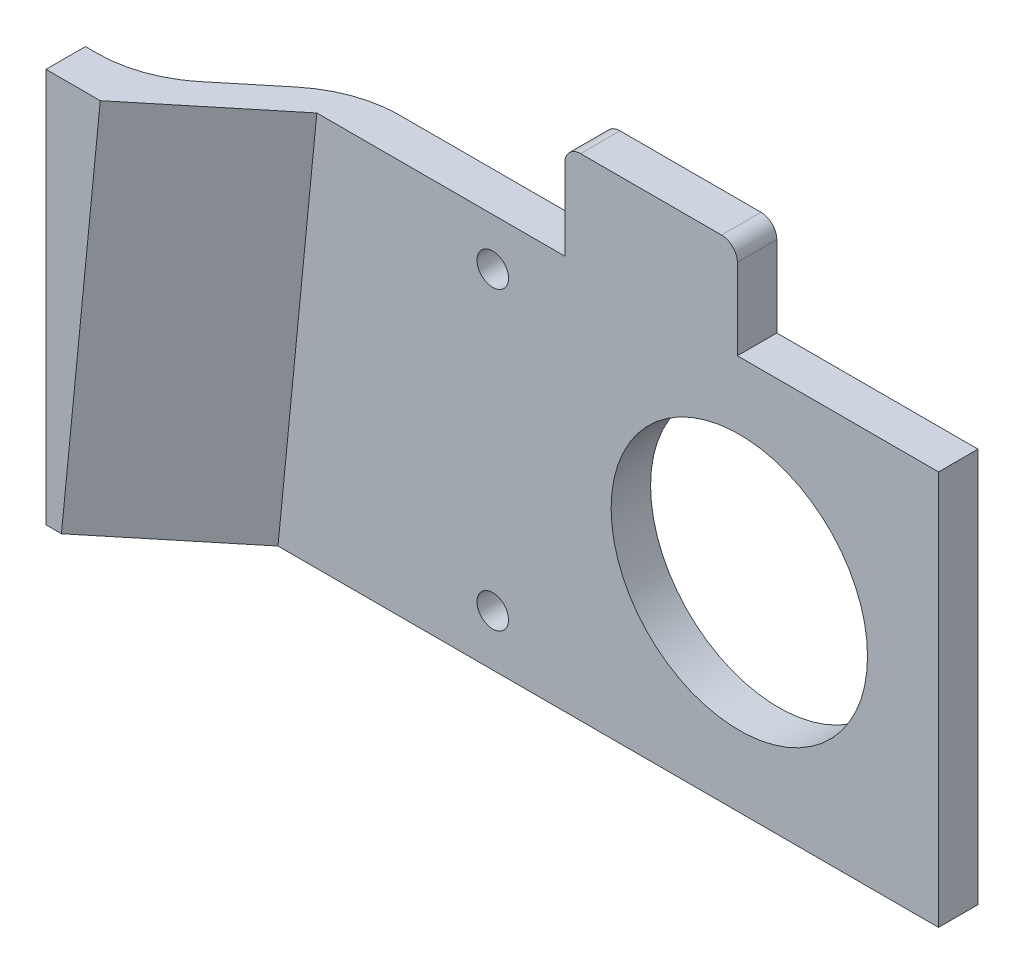
ISO-10303-21;
HEADER;
FILE_DESCRIPTION(('STEP AP214'),'2;1');
FILE_NAME('part.step','',(''),(''),'','','');
FILE_SCHEMA(('AUTOMOTIVE_DESIGN { 1 0 10303 214 1 1 1 1 }'));
ENDSEC;
DATA;
#1=APPLICATION_CONTEXT('core data for automotive mechanical design processes');
#2=APPLICATION_PROTOCOL_DEFINITION('international standard','automotive_design',2000,#1);
#3=PRODUCT_CONTEXT('',#1,'mechanical');
#4=PRODUCT('Part','Part','',(#3));
#5=PRODUCT_RELATED_PRODUCT_CATEGORY('part','',(#4));
#6=PRODUCT_DEFINITION_FORMATION('','',#4);
#7=PRODUCT_DEFINITION_CONTEXT('part definition',#1,'design');
#8=PRODUCT_DEFINITION('design','',#6,#7);
#9=PRODUCT_DEFINITION_SHAPE('','',#8);
#10=(LENGTH_UNIT() NAMED_UNIT(*) SI_UNIT(.MILLI.,.METRE.));
#11=(NAMED_UNIT(*) PLANE_ANGLE_UNIT() SI_UNIT($,.RADIAN.));
#12=(NAMED_UNIT(*) SI_UNIT($,.STERADIAN.) SOLID_ANGLE_UNIT());
#13=UNCERTAINTY_MEASURE_WITH_UNIT(LENGTH_MEASURE(1.E-05),#10,'distance_accuracy_value','');
#14=(GEOMETRIC_REPRESENTATION_CONTEXT(3) GLOBAL_UNCERTAINTY_ASSIGNED_CONTEXT((#13)) GLOBAL_UNIT_ASSIGNED_CONTEXT((#10,
#11,#12)) REPRESENTATION_CONTEXT('',''));
#15=CARTESIAN_POINT('',(0.,0.,0.));
#16=DIRECTION('',(0.,0.,1.));
#17=DIRECTION('',(1.,0.,0.));
#18=AXIS2_PLACEMENT_3D('',#15,#16,#17);
#19=CARTESIAN_POINT('',(47.2143168379992,-4.64753017723971,57.5060662904832));
#20=DIRECTION('',(-0.633322094914091,0.0623409115104892,-0.771373278540078));
#21=DIRECTION('',(-0.772876590210645,0.,0.634556361802769));
#22=AXIS2_PLACEMENT_3D('',#19,#20,#21);
#23=PLANE('',#22);
#24=DIRECTION('',(0.0979613156523279,0.995190223342083,0.));
#25=VECTOR('',#24,1.);
#26=CARTESIAN_POINT('',(59.4394379474624,18.6288012395591,49.3500000000001));
#27=LINE('',#26,#25);
#28=CARTESIAN_POINT('',(56.6115251519666,-10.1,49.35));
#29=VERTEX_POINT('',#28);
#30=CARTESIAN_POINT('',(58.5802204497027,9.9,49.35));
#31=VERTEX_POINT('',#30);
#32=EDGE_CURVE('E213',#29,#31,#27,.T.);
#33=ORIENTED_EDGE('',*,*,#32,.T.);
#34=DIRECTION('',(-0.772876590210645,0.,0.634556361802769));
#35=VECTOR('',#34,1.);
#36=CARTESIAN_POINT('',(47.7909215407242,9.9,58.208358952518));
#37=LINE('',#36,#35);
#38=CARTESIAN_POINT('',(52.5512223152048,9.9,54.3));
#39=VERTEX_POINT('',#38);
#40=EDGE_CURVE('E315',#31,#39,#37,.T.);
#41=ORIENTED_EDGE('',*,*,#40,.T.);
#42=DIRECTION('',(-0.0979613156523277,-0.995190223342083,0.));
#43=VECTOR('',#42,1.);
#44=CARTESIAN_POINT('',(50.2306631430652,-13.6745894736284,54.3));
#45=LINE('',#44,#43);
#46=CARTESIAN_POINT('',(50.5825270174687,-10.1,54.3));
#47=VERTEX_POINT('',#46);
#48=EDGE_CURVE('E208',#39,#47,#45,.T.);
#49=ORIENTED_EDGE('',*,*,#48,.T.);
#50=DIRECTION('',(-0.772876590210645,0.,0.634556361802769));
#51=VECTOR('',#50,1.);
#52=CARTESIAN_POINT('',(46.9982031951358,-10.1,57.2428443208543));
#53=LINE('',#52,#51);
#54=EDGE_CURVE('E227',#29,#47,#53,.T.);
#55=ORIENTED_EDGE('',*,*,#54,.F.);
#56=EDGE_LOOP('',(#33,#41,#49,#55));
#57=FACE_BOUND('',#56,.T.);
#58=ADVANCED_FACE('F37',(#57),#23,.F.);
#59=CARTESIAN_POINT('',(50.4500000000004,-10.15,54.3));
#60=DIRECTION('',(0.,0.,-1.));
#61=DIRECTION('',(-1.,0.,0.));
#62=AXIS2_PLACEMENT_3D('',#59,#60,#61);
#63=PLANE('',#62);
#64=ORIENTED_EDGE('',*,*,#48,.F.);
#65=DIRECTION('',(-1.,0.,0.));
#66=VECTOR('',#65,1.);
#67=CARTESIAN_POINT('',(50.4500000000004,9.89999999999999,54.3));
#68=LINE('',#67,#66);
#69=CARTESIAN_POINT('',(49.8000000000002,9.9,54.3));
#70=VERTEX_POINT('',#69);
#71=EDGE_CURVE('E311',#39,#70,#68,.T.);
#72=ORIENTED_EDGE('',*,*,#71,.T.);
#73=DIRECTION('',(0.,1.,0.));
#74=VECTOR('',#73,1.);
#75=CARTESIAN_POINT('',(49.8000000000002,-10.15,54.3));
#76=LINE('',#75,#74);
#77=CARTESIAN_POINT('',(49.8000000000002,-10.1,54.3));
#78=VERTEX_POINT('',#77);
#79=EDGE_CURVE('E275',#78,#70,#76,.T.);
#80=ORIENTED_EDGE('',*,*,#79,.F.);
#81=DIRECTION('',(-1.,0.,0.));
#82=VECTOR('',#81,1.);
#83=CARTESIAN_POINT('',(50.4500000000004,-10.1,54.3));
#84=LINE('',#83,#82);
#85=EDGE_CURVE('E257',#47,#78,#84,.T.);
#86=ORIENTED_EDGE('',*,*,#85,.F.);
#87=EDGE_LOOP('',(#64,#72,#80,#86));
#88=FACE_BOUND('',#87,.T.);
#89=ADVANCED_FACE('F296',(#88),#63,.F.);
#90=CARTESIAN_POINT('',(89.45,-10.15,49.35));
#91=DIRECTION('',(0.,0.,-1.));
#92=DIRECTION('',(-1.,0.,0.));
#93=AXIS2_PLACEMENT_3D('',#90,#91,#92);
#94=PLANE('',#93);
#95=CARTESIAN_POINT('',(67.5000000000002,7.5,49.35));
#96=DIRECTION('',(0.,0.,1.));
#97=DIRECTION('',(1.,0.,0.));
#98=AXIS2_PLACEMENT_3D('',#95,#96,#97);
#99=CIRCLE('',#98,0.799999999999995);
#100=CARTESIAN_POINT('',(68.3000000000002,7.5,49.35));
#101=VERTEX_POINT('',#100);
#102=EDGE_CURVE('E243',#101,#101,#99,.T.);
#103=ORIENTED_EDGE('',*,*,#102,.F.);
#104=EDGE_LOOP('',(#103));
#105=FACE_BOUND('',#104,.T.);
#106=CARTESIAN_POINT('',(67.5000000000002,-7.49999999999999,49.35));
#107=DIRECTION('',(0.,0.,1.));
#108=DIRECTION('',(1.,0.,0.));
#109=AXIS2_PLACEMENT_3D('',#106,#107,#108);
#110=CIRCLE('',#109,0.799999999999995);
#111=CARTESIAN_POINT('',(68.3000000000002,-7.49999999999999,49.35));
#112=VERTEX_POINT('',#111);
#113=EDGE_CURVE('E252',#112,#112,#110,.T.);
#114=ORIENTED_EDGE('',*,*,#113,.F.);
#115=EDGE_LOOP('',(#114));
#116=FACE_BOUND('',#115,.T.);
#117=CARTESIAN_POINT('',(80.0000000000002,0.,49.35));
#118=DIRECTION('',(0.,0.,1.));
#119=DIRECTION('',(1.,0.,0.));
#120=AXIS2_PLACEMENT_3D('',#117,#118,#119);
#121=CIRCLE('',#120,6.5);
#122=CARTESIAN_POINT('',(86.5000000000002,0.,49.35));
#123=VERTEX_POINT('',#122);
#124=EDGE_CURVE('E238',#123,#123,#121,.T.);
#125=ORIENTED_EDGE('',*,*,#124,.F.);
#126=EDGE_LOOP('',(#125));
#127=FACE_BOUND('',#126,.T.);
#128=DIRECTION('',(0.,1.,0.));
#129=VECTOR('',#128,1.);
#130=CARTESIAN_POINT('',(71.1500000000002,-10.15,49.35));
#131=LINE('',#130,#129);
#132=CARTESIAN_POINT('',(71.1500000000002,9.9,49.35));
#133=VERTEX_POINT('',#132);
#134=CARTESIAN_POINT('',(71.1500000000002,14.,49.35));
#135=VERTEX_POINT('',#134);
#136=EDGE_CURVE('E323',#133,#135,#131,.T.);
#137=ORIENTED_EDGE('',*,*,#136,.F.);
#138=DIRECTION('',(-1.,0.,0.));
#139=VECTOR('',#138,1.);
#140=CARTESIAN_POINT('',(89.45,9.90000000000001,49.35));
#141=LINE('',#140,#139);
#142=EDGE_CURVE('E199',#133,#31,#141,.T.);
#143=ORIENTED_EDGE('',*,*,#142,.T.);
#144=ORIENTED_EDGE('',*,*,#32,.F.);
#145=DIRECTION('',(-1.,0.,0.));
#146=VECTOR('',#145,1.);
#147=CARTESIAN_POINT('',(89.45,-10.1,49.35));
#148=LINE('',#147,#146);
#149=CARTESIAN_POINT('',(90.1000000000002,-10.1,49.35));
#150=VERTEX_POINT('',#149);
#151=EDGE_CURVE('E261',#150,#29,#148,.T.);
#152=ORIENTED_EDGE('',*,*,#151,.F.);
#153=DIRECTION('',(0.,-1.,0.));
#154=VECTOR('',#153,1.);
#155=CARTESIAN_POINT('',(90.1000000000002,-10.15,49.35));
#156=LINE('',#155,#154);
#157=CARTESIAN_POINT('',(90.1000000000002,9.9,49.35));
#158=VERTEX_POINT('',#157);
#159=EDGE_CURVE('E273',#158,#150,#156,.T.);
#160=ORIENTED_EDGE('',*,*,#159,.F.);
#161=DIRECTION('',(-1.,0.,0.));
#162=VECTOR('',#161,1.);
#163=CARTESIAN_POINT('',(89.45,9.9,49.35));
#164=LINE('',#163,#162);
#165=CARTESIAN_POINT('',(79.9000000000002,9.9,49.35));
#166=VERTEX_POINT('',#165);
#167=EDGE_CURVE('E389',#158,#166,#164,.T.);
#168=ORIENTED_EDGE('',*,*,#167,.T.);
#169=DIRECTION('',(0.,-1.,0.));
#170=VECTOR('',#169,1.);
#171=CARTESIAN_POINT('',(79.9000000000002,-10.15,49.35));
#172=LINE('',#171,#170);
#173=CARTESIAN_POINT('',(79.9000000000002,14.,49.35));
#174=VERTEX_POINT('',#173);
#175=EDGE_CURVE('E407',#174,#166,#172,.T.);
#176=ORIENTED_EDGE('',*,*,#175,.F.);
#177=CARTESIAN_POINT('',(79.1000000000002,14.,49.35));
#178=DIRECTION('',(0.,0.,-1.));
#179=DIRECTION('',(-1.,0.,0.));
#180=AXIS2_PLACEMENT_3D('',#177,#178,#179);
#181=CIRCLE('',#180,0.799999999999998);
#182=CARTESIAN_POINT('',(79.1000000000002,14.8,49.35));
#183=VERTEX_POINT('',#182);
#184=EDGE_CURVE('E172',#183,#174,#181,.T.);
#185=ORIENTED_EDGE('',*,*,#184,.F.);
#186=DIRECTION('',(1.,0.,0.));
#187=VECTOR('',#186,1.);
#188=CARTESIAN_POINT('',(89.45,14.8,49.35));
#189=LINE('',#188,#187);
#190=CARTESIAN_POINT('',(71.9500000000002,14.8,49.35));
#191=VERTEX_POINT('',#190);
#192=EDGE_CURVE('E336',#191,#183,#189,.T.);
#193=ORIENTED_EDGE('',*,*,#192,.F.);
#194=CARTESIAN_POINT('',(71.9500000000002,14.,49.35));
#195=DIRECTION('',(0.,0.,-1.));
#196=DIRECTION('',(-1.,0.,0.));
#197=AXIS2_PLACEMENT_3D('',#194,#195,#196);
#198=CIRCLE('',#197,0.799999999999998);
#199=EDGE_CURVE('E334',#135,#191,#198,.T.);
#200=ORIENTED_EDGE('',*,*,#199,.F.);
#201=EDGE_LOOP('',(#137,#143,#144,#152,#160,#168,#176,#185,#193,#200));
#202=FACE_BOUND('',#201,.T.);
#203=ADVANCED_FACE('F39',(#105,#116,#127,#202),#94,.F.);
#204=CARTESIAN_POINT('',(49.8000000000002,10.1,39.35));
#205=DIRECTION('',(-1.,0.,0.));
#206=DIRECTION('',(0.,0.,1.));
#207=AXIS2_PLACEMENT_3D('',#204,#205,#206);
#208=PLANE('',#207);
#209=DIRECTION('',(0.,0.,1.));
#210=VECTOR('',#209,1.);
#211=CARTESIAN_POINT('',(49.8000000000002,9.9,44.35));
#212=LINE('',#211,#210);
#213=CARTESIAN_POINT('',(49.8000000000002,9.9,52.3));
#214=VERTEX_POINT('',#213);
#215=EDGE_CURVE('E200',#214,#70,#212,.T.);
#216=ORIENTED_EDGE('',*,*,#215,.F.);
#217=DIRECTION('',(0.,-1.,0.));
#218=VECTOR('',#217,1.);
#219=CARTESIAN_POINT('',(49.8000000000002,-10.15,52.3));
#220=LINE('',#219,#218);
#221=CARTESIAN_POINT('',(49.8000000000002,-10.1,52.3));
#222=VERTEX_POINT('',#221);
#223=EDGE_CURVE('E164',#214,#222,#220,.T.);
#224=ORIENTED_EDGE('',*,*,#223,.T.);
#225=DIRECTION('',(0.,0.,1.));
#226=VECTOR('',#225,1.);
#227=CARTESIAN_POINT('',(49.8000000000002,-10.1,39.35));
#228=LINE('',#227,#226);
#229=EDGE_CURVE('E237',#222,#78,#228,.T.);
#230=ORIENTED_EDGE('',*,*,#229,.T.);
#231=ORIENTED_EDGE('',*,*,#79,.T.);
#232=EDGE_LOOP('',(#216,#224,#230,#231));
#233=FACE_BOUND('',#232,.T.);
#234=ADVANCED_FACE('F303',(#233),#208,.T.);
#235=CARTESIAN_POINT('',(90.1000000000002,10.1,39.35));
#236=DIRECTION('',(1.,0.,0.));
#237=DIRECTION('',(0.,0.,-1.));
#238=AXIS2_PLACEMENT_3D('',#235,#236,#237);
#239=PLANE('',#238);
#240=DIRECTION('',(0.,0.,1.));
#241=VECTOR('',#240,1.);
#242=CARTESIAN_POINT('',(90.1000000000002,9.9,44.35));
#243=LINE('',#242,#241);
#244=CARTESIAN_POINT('',(90.1000000000002,9.9,47.35));
#245=VERTEX_POINT('',#244);
#246=EDGE_CURVE('E400',#245,#158,#243,.T.);
#247=ORIENTED_EDGE('',*,*,#246,.T.);
#248=ORIENTED_EDGE('',*,*,#159,.T.);
#249=DIRECTION('',(0.,0.,1.));
#250=VECTOR('',#249,1.);
#251=CARTESIAN_POINT('',(90.1000000000002,-10.1,39.35));
#252=LINE('',#251,#250);
#253=CARTESIAN_POINT('',(90.1000000000002,-10.1,47.35));
#254=VERTEX_POINT('',#253);
#255=EDGE_CURVE('E254',#254,#150,#252,.T.);
#256=ORIENTED_EDGE('',*,*,#255,.F.);
#257=DIRECTION('',(0.,1.,0.));
#258=VECTOR('',#257,1.);
#259=CARTESIAN_POINT('',(90.1000000000002,-10.15,47.35));
#260=LINE('',#259,#258);
#261=EDGE_CURVE('E230',#254,#245,#260,.T.);
#262=ORIENTED_EDGE('',*,*,#261,.T.);
#263=EDGE_LOOP('',(#247,#248,#256,#262));
#264=FACE_BOUND('',#263,.T.);
#265=ADVANCED_FACE('F366',(#264),#239,.T.);
#266=CARTESIAN_POINT('',(49.8000000000002,-10.1,39.35));
#267=DIRECTION('',(0.,-1.,0.));
#268=DIRECTION('',(1.,0.,0.));
#269=AXIS2_PLACEMENT_3D('',#266,#267,#268);
#270=PLANE('',#269);
#271=DIRECTION('',(1.,0.,0.));
#272=VECTOR('',#271,1.);
#273=CARTESIAN_POINT('',(49.7500000000004,-10.1,52.3));
#274=LINE('',#273,#272);
#275=CARTESIAN_POINT('',(50.4097411583436,-10.1,52.3));
#276=VERTEX_POINT('',#275);
#277=EDGE_CURVE('E271',#222,#276,#274,.T.);
#278=ORIENTED_EDGE('',*,*,#277,.T.);
#279=DIRECTION('',(0.999994542016877,0.,-0.00330392742912632));
#280=VECTOR('',#279,1.);
#281=CARTESIAN_POINT('',(50.4097411583436,-10.1,52.3));
#282=LINE('',#281,#280);
#283=CARTESIAN_POINT('',(50.4500000000004,-10.1,52.2998669869828));
#284=VERTEX_POINT('',#283);
#285=EDGE_CURVE('E269',#276,#284,#282,.T.);
#286=ORIENTED_EDGE('',*,*,#285,.T.);
#287=CARTESIAN_POINT('',(50.4098552102629,-10.1,46.3));
#288=DIRECTION('',(0.,1.,0.));
#289=DIRECTION('',(-1.,0.,0.));
#290=AXIS2_PLACEMENT_3D('',#287,#288,#289);
#291=ELLIPSE('',#290,6.02899813449793,6.);
#292=CARTESIAN_POINT('',(54.2466068575516,-10.1,50.9282396712405));
#293=VERTEX_POINT('',#292);
#294=EDGE_CURVE('E267',#284,#293,#291,.T.);
#295=ORIENTED_EDGE('',*,*,#294,.T.);
#296=DIRECTION('',(0.772876590210646,0.,-0.634556361802768));
#297=VECTOR('',#296,1.);
#298=CARTESIAN_POINT('',(54.2466068575516,-10.1,50.9282396712405));
#299=LINE('',#298,#297);
#300=CARTESIAN_POINT('',(56.9340532897993,-10.1,48.7217603287595));
#301=VERTEX_POINT('',#300);
#302=EDGE_CURVE('E265',#293,#301,#299,.T.);
#303=ORIENTED_EDGE('',*,*,#302,.T.);
#304=CARTESIAN_POINT('',(60.770804937088,-10.1,53.35));
#305=DIRECTION('',(0.,-1.,0.));
#306=DIRECTION('',(-1.,0.,0.));
#307=AXIS2_PLACEMENT_3D('',#304,#305,#306);
#308=ELLIPSE('',#307,6.02899813449793,6.);
#309=CARTESIAN_POINT('',(60.770804937088,-10.1,47.35));
#310=VERTEX_POINT('',#309);
#311=EDGE_CURVE('E60',#301,#310,#308,.T.);
#312=ORIENTED_EDGE('',*,*,#311,.T.);
#313=DIRECTION('',(1.,0.,0.));
#314=VECTOR('',#313,1.);
#315=CARTESIAN_POINT('',(89.45,-10.1,47.35));
#316=LINE('',#315,#314);
#317=EDGE_CURVE('E205',#310,#254,#316,.T.);
#318=ORIENTED_EDGE('',*,*,#317,.T.);
#319=ORIENTED_EDGE('',*,*,#255,.T.);
#320=ORIENTED_EDGE('',*,*,#151,.T.);
#321=ORIENTED_EDGE('',*,*,#54,.T.);
#322=ORIENTED_EDGE('',*,*,#85,.T.);
#323=ORIENTED_EDGE('',*,*,#229,.F.);
#324=EDGE_LOOP('',(#278,#286,#295,#303,#312,#318,#319,#320,#321,#322,#323));
#325=FACE_BOUND('',#324,.T.);
#326=ADVANCED_FACE('F294',(#325),#270,.T.);
#327=CARTESIAN_POINT('',(49.7500000000004,-10.15,52.3));
#328=DIRECTION('',(0.,0.,1.));
#329=DIRECTION('',(1.,0.,0.));
#330=AXIS2_PLACEMENT_3D('',#327,#328,#329);
#331=PLANE('',#330);
#332=ORIENTED_EDGE('',*,*,#223,.F.);
#333=DIRECTION('',(1.,0.,0.));
#334=VECTOR('',#333,1.);
#335=CARTESIAN_POINT('',(49.7500000000004,9.89999999999999,52.3));
#336=LINE('',#335,#334);
#337=CARTESIAN_POINT('',(50.4097411583436,9.89999999999999,52.3));
#338=VERTEX_POINT('',#337);
#339=EDGE_CURVE('E324',#214,#338,#336,.T.);
#340=ORIENTED_EDGE('',*,*,#339,.T.);
#341=DIRECTION('',(0.,1.,0.));
#342=VECTOR('',#341,1.);
#343=CARTESIAN_POINT('',(50.4097411583436,-10.15,52.3));
#344=LINE('',#343,#342);
#345=EDGE_CURVE('E224',#276,#338,#344,.T.);
#346=ORIENTED_EDGE('',*,*,#345,.F.);
#347=ORIENTED_EDGE('',*,*,#277,.F.);
#348=EDGE_LOOP('',(#332,#340,#346,#347));
#349=FACE_BOUND('',#348,.T.);
#350=ADVANCED_FACE('F291',(#349),#331,.F.);
#351=CARTESIAN_POINT('',(50.4097411583436,-10.15,52.3));
#352=DIRECTION('',(0.00330392742912632,0.,0.999994542016877));
#353=DIRECTION('',(0.999994542016877,0.,-0.00330392742912632));
#354=AXIS2_PLACEMENT_3D('',#351,#352,#353);
#355=PLANE('',#354);
#356=ORIENTED_EDGE('',*,*,#345,.T.);
#357=DIRECTION('',(0.999994542016877,0.,-0.00330392742912632));
#358=VECTOR('',#357,1.);
#359=CARTESIAN_POINT('',(50.4097411583435,9.89999999999999,52.3));
#360=LINE('',#359,#358);
#361=CARTESIAN_POINT('',(50.4500000000004,9.89999999999998,52.2998669869828));
#362=VERTEX_POINT('',#361);
#363=EDGE_CURVE('E328',#338,#362,#360,.T.);
#364=ORIENTED_EDGE('',*,*,#363,.T.);
#365=DIRECTION('',(0.,1.,0.));
#366=VECTOR('',#365,1.);
#367=CARTESIAN_POINT('',(50.4500000000004,-10.15,52.2998669869828));
#368=LINE('',#367,#366);
#369=EDGE_CURVE('E221',#284,#362,#368,.T.);
#370=ORIENTED_EDGE('',*,*,#369,.F.);
#371=ORIENTED_EDGE('',*,*,#285,.F.);
#372=EDGE_LOOP('',(#356,#364,#370,#371));
#373=FACE_BOUND('',#372,.T.);
#374=ADVANCED_FACE('F286',(#373),#355,.F.);
#375=CARTESIAN_POINT('',(50.4098552102629,-10.15,46.3));
#376=DIRECTION('',(0.,1.,0.));
#377=DIRECTION('',(-1.,0.,0.));
#378=AXIS2_PLACEMENT_3D('',#375,#376,#377);
#379=ELLIPSE('',#378,6.02899813449793,6.);
#380=DIRECTION('',(0.,1.,0.));
#381=VECTOR('',#380,1.);
#382=SURFACE_OF_LINEAR_EXTRUSION('',#379,#381);
#383=ORIENTED_EDGE('',*,*,#369,.T.);
#384=CARTESIAN_POINT('',(50.4098552102629,9.89999999999998,46.3));
#385=DIRECTION('',(0.,1.,0.));
#386=DIRECTION('',(-1.,0.,0.));
#387=AXIS2_PLACEMENT_3D('',#384,#385,#386);
#388=ELLIPSE('',#387,6.02899813449793,6.);
#389=CARTESIAN_POINT('',(54.2466068575516,9.89999999999999,50.9282396712405));
#390=VERTEX_POINT('',#389);
#391=EDGE_CURVE('E386',#362,#390,#388,.T.);
#392=ORIENTED_EDGE('',*,*,#391,.T.);
#393=DIRECTION('',(0.,1.,0.));
#394=VECTOR('',#393,1.);
#395=CARTESIAN_POINT('',(54.2466068575516,-10.15,50.9282396712405));
#396=LINE('',#395,#394);
#397=EDGE_CURVE('E211',#293,#390,#396,.T.);
#398=ORIENTED_EDGE('',*,*,#397,.F.);
#399=ORIENTED_EDGE('',*,*,#294,.F.);
#400=EDGE_LOOP('',(#383,#392,#398,#399));
#401=FACE_BOUND('',#400,.T.);
#402=ADVANCED_FACE('F281',(#401),#382,.F.);
#403=CARTESIAN_POINT('',(54.2466068575516,-10.15,50.9282396712405));
#404=DIRECTION('',(0.634556361802768,0.,0.772876590210646));
#405=DIRECTION('',(0.772876590210646,0.,-0.634556361802768));
#406=AXIS2_PLACEMENT_3D('',#403,#404,#405);
#407=PLANE('',#406);
#408=ORIENTED_EDGE('',*,*,#397,.T.);
#409=DIRECTION('',(0.772876590210646,0.,-0.634556361802768));
#410=VECTOR('',#409,1.);
#411=CARTESIAN_POINT('',(54.2466068575516,9.89999999999999,50.9282396712405));
#412=LINE('',#411,#410);
#413=CARTESIAN_POINT('',(56.9340532897993,9.89999999999997,48.7217603287595));
#414=VERTEX_POINT('',#413);
#415=EDGE_CURVE('E384',#390,#414,#412,.T.);
#416=ORIENTED_EDGE('',*,*,#415,.T.);
#417=DIRECTION('',(0.,1.,0.));
#418=VECTOR('',#417,1.);
#419=CARTESIAN_POINT('',(56.9340532897993,-10.15,48.7217603287595));
#420=LINE('',#419,#418);
#421=EDGE_CURVE('E207',#301,#414,#420,.T.);
#422=ORIENTED_EDGE('',*,*,#421,.F.);
#423=ORIENTED_EDGE('',*,*,#302,.F.);
#424=EDGE_LOOP('',(#408,#416,#422,#423));
#425=FACE_BOUND('',#424,.T.);
#426=ADVANCED_FACE('F285',(#425),#407,.F.);
#427=CARTESIAN_POINT('',(60.770804937088,-10.15,53.35));
#428=DIRECTION('',(0.,-1.,0.));
#429=DIRECTION('',(-1.,0.,0.));
#430=AXIS2_PLACEMENT_3D('',#427,#428,#429);
#431=ELLIPSE('',#430,6.02899813449793,6.);
#432=DIRECTION('',(0.,1.,0.));
#433=VECTOR('',#432,1.);
#434=SURFACE_OF_LINEAR_EXTRUSION('',#431,#433);
#435=ORIENTED_EDGE('',*,*,#421,.T.);
#436=CARTESIAN_POINT('',(60.770804937088,9.89999999999997,53.35));
#437=DIRECTION('',(0.,-1.,0.));
#438=DIRECTION('',(-1.,0.,0.));
#439=AXIS2_PLACEMENT_3D('',#436,#437,#438);
#440=ELLIPSE('',#439,6.02899813449793,6.);
#441=CARTESIAN_POINT('',(60.770804937088,9.9,47.35));
#442=VERTEX_POINT('',#441);
#443=EDGE_CURVE('E380',#414,#442,#440,.T.);
#444=ORIENTED_EDGE('',*,*,#443,.T.);
#445=DIRECTION('',(0.,1.,0.));
#446=VECTOR('',#445,1.);
#447=CARTESIAN_POINT('',(60.770804937088,-10.15,47.35));
#448=LINE('',#447,#446);
#449=EDGE_CURVE('E203',#310,#442,#448,.T.);
#450=ORIENTED_EDGE('',*,*,#449,.F.);
#451=ORIENTED_EDGE('',*,*,#311,.F.);
#452=EDGE_LOOP('',(#435,#444,#450,#451));
#453=FACE_BOUND('',#452,.T.);
#454=ADVANCED_FACE('F356',(#453),#434,.F.);
#455=CARTESIAN_POINT('',(89.45,-10.15,47.35));
#456=DIRECTION('',(0.,0.,1.));
#457=DIRECTION('',(1.,0.,0.));
#458=AXIS2_PLACEMENT_3D('',#455,#456,#457);
#459=PLANE('',#458);
#460=ORIENTED_EDGE('',*,*,#449,.T.);
#461=DIRECTION('',(1.,0.,0.));
#462=VECTOR('',#461,1.);
#463=CARTESIAN_POINT('',(89.45,9.90000000000001,47.35));
#464=LINE('',#463,#462);
#465=CARTESIAN_POINT('',(71.1500000000002,9.9,47.35));
#466=VERTEX_POINT('',#465);
#467=EDGE_CURVE('E11',#442,#466,#464,.T.);
#468=ORIENTED_EDGE('',*,*,#467,.T.);
#469=DIRECTION('',(0.,-1.,0.));
#470=VECTOR('',#469,1.);
#471=CARTESIAN_POINT('',(71.1500000000002,-10.15,47.35));
#472=LINE('',#471,#470);
#473=CARTESIAN_POINT('',(71.1500000000002,14.,47.35));
#474=VERTEX_POINT('',#473);
#475=EDGE_CURVE('E45',#474,#466,#472,.T.);
#476=ORIENTED_EDGE('',*,*,#475,.F.);
#477=CARTESIAN_POINT('',(71.9500000000002,14.,47.35));
#478=DIRECTION('',(0.,0.,1.));
#479=DIRECTION('',(1.,0.,0.));
#480=AXIS2_PLACEMENT_3D('',#477,#478,#479);
#481=CIRCLE('',#480,0.799999999999998);
#482=CARTESIAN_POINT('',(71.9500000000002,14.8,47.35));
#483=VERTEX_POINT('',#482);
#484=EDGE_CURVE('E181',#483,#474,#481,.T.);
#485=ORIENTED_EDGE('',*,*,#484,.F.);
#486=DIRECTION('',(-1.,0.,0.));
#487=VECTOR('',#486,1.);
#488=CARTESIAN_POINT('',(89.45,14.8,47.35));
#489=LINE('',#488,#487);
#490=CARTESIAN_POINT('',(79.1000000000002,14.8,47.35));
#491=VERTEX_POINT('',#490);
#492=EDGE_CURVE('E179',#491,#483,#489,.T.);
#493=ORIENTED_EDGE('',*,*,#492,.F.);
#494=CARTESIAN_POINT('',(79.1000000000002,14.,47.35));
#495=DIRECTION('',(0.,0.,1.));
#496=DIRECTION('',(1.,0.,0.));
#497=AXIS2_PLACEMENT_3D('',#494,#495,#496);
#498=CIRCLE('',#497,0.799999999999998);
#499=CARTESIAN_POINT('',(79.9000000000002,14.,47.35));
#500=VERTEX_POINT('',#499);
#501=EDGE_CURVE('E169',#500,#491,#498,.T.);
#502=ORIENTED_EDGE('',*,*,#501,.F.);
#503=DIRECTION('',(0.,1.,0.));
#504=VECTOR('',#503,1.);
#505=CARTESIAN_POINT('',(79.9000000000002,-10.15,47.35));
#506=LINE('',#505,#504);
#507=CARTESIAN_POINT('',(79.9000000000002,9.9,47.35));
#508=VERTEX_POINT('',#507);
#509=EDGE_CURVE('E155',#508,#500,#506,.T.);
#510=ORIENTED_EDGE('',*,*,#509,.F.);
#511=DIRECTION('',(1.,0.,0.));
#512=VECTOR('',#511,1.);
#513=CARTESIAN_POINT('',(89.45,9.9,47.35));
#514=LINE('',#513,#512);
#515=EDGE_CURVE('E163',#508,#245,#514,.T.);
#516=ORIENTED_EDGE('',*,*,#515,.T.);
#517=ORIENTED_EDGE('',*,*,#261,.F.);
#518=ORIENTED_EDGE('',*,*,#317,.F.);
#519=EDGE_LOOP('',(#460,#468,#476,#485,#493,#502,#510,#516,#517,#518));
#520=FACE_BOUND('',#519,.T.);
#521=CARTESIAN_POINT('',(67.5000000000002,7.5,47.35));
#522=DIRECTION('',(0.,0.,1.));
#523=DIRECTION('',(1.,0.,0.));
#524=AXIS2_PLACEMENT_3D('',#521,#522,#523);
#525=CIRCLE('',#524,0.799999999999995);
#526=CARTESIAN_POINT('',(68.3000000000002,7.5,47.35));
#527=VERTEX_POINT('',#526);
#528=EDGE_CURVE('E242',#527,#527,#525,.T.);
#529=ORIENTED_EDGE('',*,*,#528,.T.);
#530=EDGE_LOOP('',(#529));
#531=FACE_BOUND('',#530,.T.);
#532=CARTESIAN_POINT('',(67.5000000000002,-7.49999999999999,47.35));
#533=DIRECTION('',(0.,0.,1.));
#534=DIRECTION('',(1.,0.,0.));
#535=AXIS2_PLACEMENT_3D('',#532,#533,#534);
#536=CIRCLE('',#535,0.799999999999995);
#537=CARTESIAN_POINT('',(68.3000000000002,-7.49999999999999,47.35));
#538=VERTEX_POINT('',#537);
#539=EDGE_CURVE('E239',#538,#538,#536,.T.);
#540=ORIENTED_EDGE('',*,*,#539,.T.);
#541=EDGE_LOOP('',(#540));
#542=FACE_BOUND('',#541,.T.);
#543=CARTESIAN_POINT('',(80.0000000000002,0.,47.35));
#544=DIRECTION('',(0.,0.,1.));
#545=DIRECTION('',(1.,0.,0.));
#546=AXIS2_PLACEMENT_3D('',#543,#544,#545);
#547=CIRCLE('',#546,6.5);
#548=CARTESIAN_POINT('',(86.5000000000002,0.,47.35));
#549=VERTEX_POINT('',#548);
#550=EDGE_CURVE('E234',#549,#549,#547,.T.);
#551=ORIENTED_EDGE('',*,*,#550,.T.);
#552=EDGE_LOOP('',(#551));
#553=FACE_BOUND('',#552,.T.);
#554=ADVANCED_FACE('F176',(#520,#531,#542,#553),#459,.F.);
#555=CARTESIAN_POINT('',(80.0000000000002,0.,29.35));
#556=DIRECTION('',(0.,0.,1.));
#557=DIRECTION('',(1.,0.,0.));
#558=AXIS2_PLACEMENT_3D('',#555,#556,#557);
#559=CYLINDRICAL_SURFACE('',#558,6.5);
#560=ORIENTED_EDGE('',*,*,#124,.T.);
#561=EDGE_LOOP('',(#560));
#562=FACE_BOUND('',#561,.T.);
#563=ORIENTED_EDGE('',*,*,#550,.F.);
#564=EDGE_LOOP('',(#563));
#565=FACE_BOUND('',#564,.T.);
#566=ADVANCED_FACE('F350',(#562,#565),#559,.F.);
#567=CARTESIAN_POINT('',(67.5000000000002,-7.49999999999999,29.35));
#568=DIRECTION('',(0.,0.,1.));
#569=DIRECTION('',(1.,0.,0.));
#570=AXIS2_PLACEMENT_3D('',#567,#568,#569);
#571=CYLINDRICAL_SURFACE('',#570,0.799999999999995);
#572=ORIENTED_EDGE('',*,*,#113,.T.);
#573=EDGE_LOOP('',(#572));
#574=FACE_BOUND('',#573,.T.);
#575=ORIENTED_EDGE('',*,*,#539,.F.);
#576=EDGE_LOOP('',(#575));
#577=FACE_BOUND('',#576,.T.);
#578=ADVANCED_FACE('F344',(#574,#577),#571,.F.);
#579=CARTESIAN_POINT('',(67.5000000000002,7.5,29.35));
#580=DIRECTION('',(0.,0.,1.));
#581=DIRECTION('',(1.,0.,0.));
#582=AXIS2_PLACEMENT_3D('',#579,#580,#581);
#583=CYLINDRICAL_SURFACE('',#582,0.799999999999995);
#584=ORIENTED_EDGE('',*,*,#102,.T.);
#585=EDGE_LOOP('',(#584));
#586=FACE_BOUND('',#585,.T.);
#587=ORIENTED_EDGE('',*,*,#528,.F.);
#588=EDGE_LOOP('',(#587));
#589=FACE_BOUND('',#588,.T.);
#590=ADVANCED_FACE('F349',(#586,#589),#583,.F.);
#591=CARTESIAN_POINT('',(79.1000000000002,14.,44.35));
#592=DIRECTION('',(0.,0.,1.));
#593=DIRECTION('',(1.,0.,0.));
#594=AXIS2_PLACEMENT_3D('',#591,#592,#593);
#595=CYLINDRICAL_SURFACE('',#594,0.799999999999998);
#596=ORIENTED_EDGE('',*,*,#184,.T.);
#597=DIRECTION('',(0.,0.,1.));
#598=VECTOR('',#597,1.);
#599=CARTESIAN_POINT('',(79.9000000000002,14.,44.35));
#600=LINE('',#599,#598);
#601=EDGE_CURVE('E158',#500,#174,#600,.T.);
#602=ORIENTED_EDGE('',*,*,#601,.F.);
#603=ORIENTED_EDGE('',*,*,#501,.T.);
#604=DIRECTION('',(0.,0.,1.));
#605=VECTOR('',#604,1.);
#606=CARTESIAN_POINT('',(79.1000000000002,14.8,44.35));
#607=LINE('',#606,#605);
#608=EDGE_CURVE('E408',#491,#183,#607,.T.);
#609=ORIENTED_EDGE('',*,*,#608,.T.);
#610=EDGE_LOOP('',(#596,#602,#603,#609));
#611=FACE_BOUND('',#610,.T.);
#612=ADVANCED_FACE('F167',(#611),#595,.T.);
#613=CARTESIAN_POINT('',(0.,14.8,44.35));
#614=DIRECTION('',(0.,1.,0.));
#615=DIRECTION('',(0.,0.,1.));
#616=AXIS2_PLACEMENT_3D('',#613,#614,#615);
#617=PLANE('',#616);
#618=ORIENTED_EDGE('',*,*,#192,.T.);
#619=ORIENTED_EDGE('',*,*,#608,.F.);
#620=ORIENTED_EDGE('',*,*,#492,.T.);
#621=DIRECTION('',(0.,0.,1.));
#622=VECTOR('',#621,1.);
#623=CARTESIAN_POINT('',(71.9500000000002,14.8,44.35));
#624=LINE('',#623,#622);
#625=EDGE_CURVE('E598',#483,#191,#624,.T.);
#626=ORIENTED_EDGE('',*,*,#625,.T.);
#627=EDGE_LOOP('',(#618,#619,#620,#626));
#628=FACE_BOUND('',#627,.T.);
#629=ADVANCED_FACE('F422',(#628),#617,.T.);
#630=CARTESIAN_POINT('',(71.9500000000002,14.,44.35));
#631=DIRECTION('',(0.,0.,1.));
#632=DIRECTION('',(1.,0.,0.));
#633=AXIS2_PLACEMENT_3D('',#630,#631,#632);
#634=CYLINDRICAL_SURFACE('',#633,0.799999999999998);
#635=ORIENTED_EDGE('',*,*,#199,.T.);
#636=ORIENTED_EDGE('',*,*,#625,.F.);
#637=ORIENTED_EDGE('',*,*,#484,.T.);
#638=DIRECTION('',(0.,0.,1.));
#639=VECTOR('',#638,1.);
#640=CARTESIAN_POINT('',(71.1500000000002,14.,44.35));
#641=LINE('',#640,#639);
#642=EDGE_CURVE('E194',#474,#135,#641,.T.);
#643=ORIENTED_EDGE('',*,*,#642,.T.);
#644=EDGE_LOOP('',(#635,#636,#637,#643));
#645=FACE_BOUND('',#644,.T.);
#646=ADVANCED_FACE('F440',(#645),#634,.T.);
#647=CARTESIAN_POINT('',(71.1500000000002,0.,44.35));
#648=DIRECTION('',(-1.,0.,0.));
#649=DIRECTION('',(0.,0.,1.));
#650=AXIS2_PLACEMENT_3D('',#647,#648,#649);
#651=PLANE('',#650);
#652=ORIENTED_EDGE('',*,*,#136,.T.);
#653=ORIENTED_EDGE('',*,*,#642,.F.);
#654=ORIENTED_EDGE('',*,*,#475,.T.);
#655=DIRECTION('',(0.,0.,1.));
#656=VECTOR('',#655,1.);
#657=CARTESIAN_POINT('',(71.1500000000002,9.9,44.35));
#658=LINE('',#657,#656);
#659=EDGE_CURVE('E191',#466,#133,#658,.T.);
#660=ORIENTED_EDGE('',*,*,#659,.T.);
#661=EDGE_LOOP('',(#652,#653,#654,#660));
#662=FACE_BOUND('',#661,.T.);
#663=ADVANCED_FACE('F190',(#662),#651,.T.);
#664=CARTESIAN_POINT('',(0.,9.89999999999998,44.35));
#665=DIRECTION('',(0.,-1.,0.));
#666=DIRECTION('',(1.,0.,0.));
#667=AXIS2_PLACEMENT_3D('',#664,#665,#666);
#668=PLANE('',#667);
#669=ORIENTED_EDGE('',*,*,#40,.F.);
#670=ORIENTED_EDGE('',*,*,#142,.F.);
#671=ORIENTED_EDGE('',*,*,#659,.F.);
#672=ORIENTED_EDGE('',*,*,#467,.F.);
#673=ORIENTED_EDGE('',*,*,#443,.F.);
#674=ORIENTED_EDGE('',*,*,#415,.F.);
#675=ORIENTED_EDGE('',*,*,#391,.F.);
#676=ORIENTED_EDGE('',*,*,#363,.F.);
#677=ORIENTED_EDGE('',*,*,#339,.F.);
#678=ORIENTED_EDGE('',*,*,#215,.T.);
#679=ORIENTED_EDGE('',*,*,#71,.F.);
#680=EDGE_LOOP('',(#669,#670,#671,#672,#673,#674,#675,#676,#677,#678,#679));
#681=FACE_BOUND('',#680,.T.);
#682=ADVANCED_FACE('F196',(#681),#668,.F.);
#683=CARTESIAN_POINT('',(0.,9.9,44.35));
#684=DIRECTION('',(0.,-1.,0.));
#685=DIRECTION('',(0.,0.,-1.));
#686=AXIS2_PLACEMENT_3D('',#683,#684,#685);
#687=PLANE('',#686);
#688=ORIENTED_EDGE('',*,*,#246,.F.);
#689=ORIENTED_EDGE('',*,*,#515,.F.);
#690=DIRECTION('',(0.,0.,1.));
#691=VECTOR('',#690,1.);
#692=CARTESIAN_POINT('',(79.9000000000002,9.9,44.35));
#693=LINE('',#692,#691);
#694=EDGE_CURVE('E52',#508,#166,#693,.T.);
#695=ORIENTED_EDGE('',*,*,#694,.T.);
#696=ORIENTED_EDGE('',*,*,#167,.F.);
#697=EDGE_LOOP('',(#688,#689,#695,#696));
#698=FACE_BOUND('',#697,.T.);
#699=ADVANCED_FACE('F410',(#698),#687,.F.);
#700=CARTESIAN_POINT('',(79.9000000000002,0.,44.35));
#701=DIRECTION('',(1.,0.,0.));
#702=DIRECTION('',(0.,0.,-1.));
#703=AXIS2_PLACEMENT_3D('',#700,#701,#702);
#704=PLANE('',#703);
#705=ORIENTED_EDGE('',*,*,#175,.T.);
#706=ORIENTED_EDGE('',*,*,#694,.F.);
#707=ORIENTED_EDGE('',*,*,#509,.T.);
#708=ORIENTED_EDGE('',*,*,#601,.T.);
#709=EDGE_LOOP('',(#705,#706,#707,#708));
#710=FACE_BOUND('',#709,.T.);
#711=ADVANCED_FACE('F157',(#710),#704,.T.);
#712=CLOSED_SHELL('',(#58,#89,#203,#234,#265,#326,#350,#374,#402,#426,#454,#554,#566,#578,#590,
#612,#629,#646,#663,#682,#699,#711));
#713=MANIFOLD_SOLID_BREP('B2',#712);
#714=ADVANCED_BREP_SHAPE_REPRESENTATION('',(#18,#713),#14);
#715=SHAPE_DEFINITION_REPRESENTATION(#9,#714);
ENDSEC;
END-ISO-10303-21;
